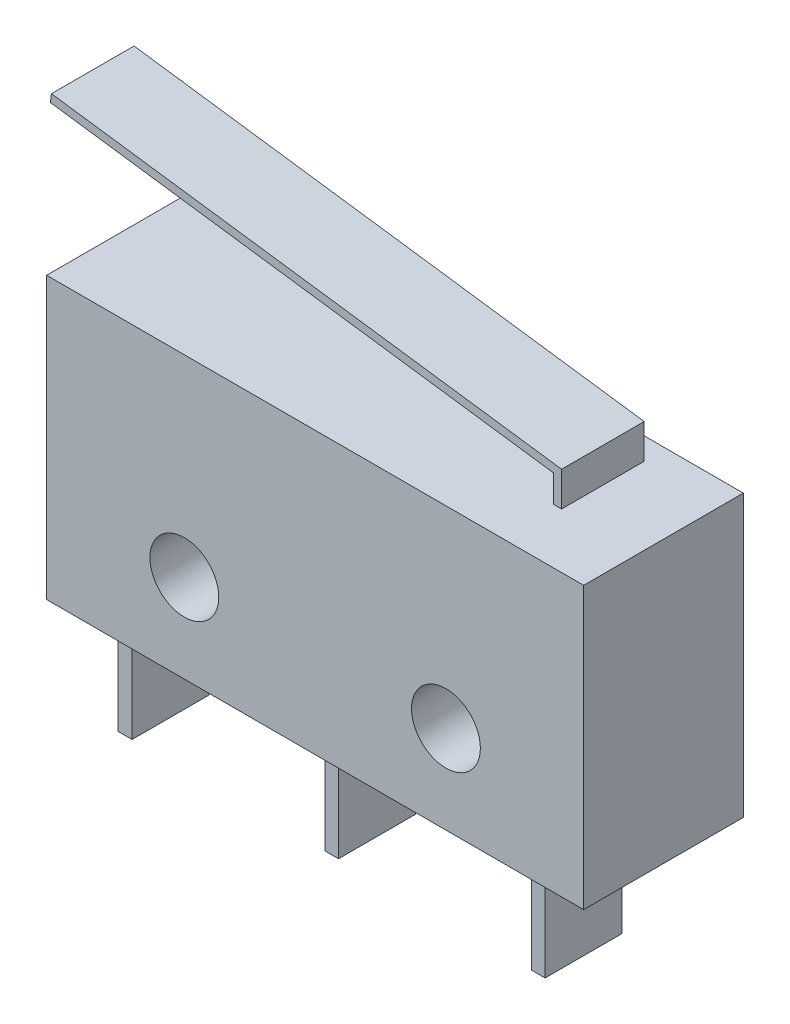
ISO-10303-21;
HEADER;
FILE_DESCRIPTION(('STEP AP214'),'2;1');
FILE_NAME('part.step','',(''),(''),'','','');
FILE_SCHEMA(('AUTOMOTIVE_DESIGN { 1 0 10303 214 1 1 1 1 }'));
ENDSEC;
DATA;
#1=APPLICATION_CONTEXT('core data for automotive mechanical design processes');
#2=APPLICATION_PROTOCOL_DEFINITION('international standard','automotive_design',2000,#1);
#3=PRODUCT_CONTEXT('',#1,'mechanical');
#4=PRODUCT('Part','Part','',(#3));
#5=PRODUCT_RELATED_PRODUCT_CATEGORY('part','',(#4));
#6=PRODUCT_DEFINITION_FORMATION('','',#4);
#7=PRODUCT_DEFINITION_CONTEXT('part definition',#1,'design');
#8=PRODUCT_DEFINITION('design','',#6,#7);
#9=PRODUCT_DEFINITION_SHAPE('','',#8);
#10=(LENGTH_UNIT() NAMED_UNIT(*) SI_UNIT(.MILLI.,.METRE.));
#11=(NAMED_UNIT(*) PLANE_ANGLE_UNIT() SI_UNIT($,.RADIAN.));
#12=(NAMED_UNIT(*) SI_UNIT($,.STERADIAN.) SOLID_ANGLE_UNIT());
#13=UNCERTAINTY_MEASURE_WITH_UNIT(LENGTH_MEASURE(1.E-05),#10,'distance_accuracy_value','');
#14=(GEOMETRIC_REPRESENTATION_CONTEXT(3) GLOBAL_UNCERTAINTY_ASSIGNED_CONTEXT((#13)) GLOBAL_UNIT_ASSIGNED_CONTEXT((#10,
#11,#12)) REPRESENTATION_CONTEXT('',''));
#15=CARTESIAN_POINT('',(0.,0.,0.));
#16=DIRECTION('',(0.,0.,1.));
#17=DIRECTION('',(1.,0.,0.));
#18=AXIS2_PLACEMENT_3D('',#15,#16,#17);
#19=CARTESIAN_POINT('',(-19.6658793052627,-12.6439834024896,-0.799999999999999));
#20=DIRECTION('',(0.,-1.,0.));
#21=DIRECTION('',(0.,0.,-1.));
#22=AXIS2_PLACEMENT_3D('',#19,#20,#21);
#23=PLANE('',#22);
#24=DIRECTION('',(-1.,0.,0.));
#25=VECTOR('',#24,1.);
#26=CARTESIAN_POINT('',(-17.4158793052627,-12.6439834024896,4.65));
#27=LINE('',#26,#25);
#28=CARTESIAN_POINT('',(-16.9158793052627,-12.6439834024896,4.65));
#29=VERTEX_POINT('',#28);
#30=CARTESIAN_POINT('',(-17.4158793052627,-12.6439834024896,4.65));
#31=VERTEX_POINT('',#30);
#32=EDGE_CURVE('E271',#29,#31,#27,.T.);
#33=ORIENTED_EDGE('',*,*,#32,.F.);
#34=DIRECTION('',(0.,0.,1.));
#35=VECTOR('',#34,1.);
#36=CARTESIAN_POINT('',(-16.9158793052627,-12.6439834024896,4.65));
#37=LINE('',#36,#35);
#38=CARTESIAN_POINT('',(-16.9158793052627,-12.6439834024896,1.85));
#39=VERTEX_POINT('',#38);
#40=EDGE_CURVE('E257',#39,#29,#37,.T.);
#41=ORIENTED_EDGE('',*,*,#40,.F.);
#42=DIRECTION('',(1.,0.,0.));
#43=VECTOR('',#42,1.);
#44=CARTESIAN_POINT('',(-16.9158793052627,-12.6439834024896,1.85));
#45=LINE('',#44,#43);
#46=CARTESIAN_POINT('',(-17.4158793052627,-12.6439834024896,1.85));
#47=VERTEX_POINT('',#46);
#48=EDGE_CURVE('E262',#47,#39,#45,.T.);
#49=ORIENTED_EDGE('',*,*,#48,.F.);
#50=DIRECTION('',(0.,0.,-1.));
#51=VECTOR('',#50,1.);
#52=CARTESIAN_POINT('',(-17.4158793052627,-12.6439834024896,1.85));
#53=LINE('',#52,#51);
#54=EDGE_CURVE('E273',#31,#47,#53,.T.);
#55=ORIENTED_EDGE('',*,*,#54,.F.);
#56=EDGE_LOOP('',(#33,#41,#49,#55));
#57=FACE_BOUND('',#56,.T.);
#58=DIRECTION('',(1.,0.,0.));
#59=VECTOR('',#58,1.);
#60=CARTESIAN_POINT('',(-19.6658793052627,-12.6439834024896,5.));
#61=LINE('',#60,#59);
#62=CARTESIAN_POINT('',(-19.6658793052627,-12.6439834024896,5.));
#63=VERTEX_POINT('',#62);
#64=CARTESIAN_POINT('',(-0.165879305262673,-12.6439834024896,5.));
#65=VERTEX_POINT('',#64);
#66=EDGE_CURVE('E315',#63,#65,#61,.T.);
#67=ORIENTED_EDGE('',*,*,#66,.F.);
#68=DIRECTION('',(0.,0.,1.));
#69=VECTOR('',#68,1.);
#70=CARTESIAN_POINT('',(-19.6658793052627,-12.6439834024896,-0.799999999999999));
#71=LINE('',#70,#69);
#72=CARTESIAN_POINT('',(-19.6658793052627,-12.6439834024896,-0.799999999999999));
#73=VERTEX_POINT('',#72);
#74=EDGE_CURVE('E11',#73,#63,#71,.T.);
#75=ORIENTED_EDGE('',*,*,#74,.F.);
#76=DIRECTION('',(1.,0.,0.));
#77=VECTOR('',#76,1.);
#78=CARTESIAN_POINT('',(-19.6658793052627,-12.6439834024896,-0.799999999999999));
#79=LINE('',#78,#77);
#80=CARTESIAN_POINT('',(-0.165879305262673,-12.6439834024896,-0.799999999999999));
#81=VERTEX_POINT('',#80);
#82=EDGE_CURVE('E316',#73,#81,#79,.T.);
#83=ORIENTED_EDGE('',*,*,#82,.T.);
#84=DIRECTION('',(0.,0.,1.));
#85=VECTOR('',#84,1.);
#86=CARTESIAN_POINT('',(-0.165879305262673,-12.6439834024896,-0.799999999999999));
#87=LINE('',#86,#85);
#88=EDGE_CURVE('E42',#81,#65,#87,.T.);
#89=ORIENTED_EDGE('',*,*,#88,.T.);
#90=EDGE_LOOP('',(#67,#75,#83,#89));
#91=FACE_BOUND('',#90,.T.);
#92=DIRECTION('',(-1.,0.,0.));
#93=VECTOR('',#92,1.);
#94=CARTESIAN_POINT('',(-9.91587930526267,-12.6439834024896,4.65));
#95=LINE('',#94,#93);
#96=CARTESIAN_POINT('',(-9.41587930526267,-12.6439834024896,4.65));
#97=VERTEX_POINT('',#96);
#98=CARTESIAN_POINT('',(-9.91587930526267,-12.6439834024896,4.65));
#99=VERTEX_POINT('',#98);
#100=EDGE_CURVE('E300',#97,#99,#95,.T.);
#101=ORIENTED_EDGE('',*,*,#100,.F.);
#102=DIRECTION('',(0.,0.,1.));
#103=VECTOR('',#102,1.);
#104=CARTESIAN_POINT('',(-9.41587930526267,-12.6439834024896,4.65));
#105=LINE('',#104,#103);
#106=CARTESIAN_POINT('',(-9.41587930526267,-12.6439834024896,1.85));
#107=VERTEX_POINT('',#106);
#108=EDGE_CURVE('E286',#107,#97,#105,.T.);
#109=ORIENTED_EDGE('',*,*,#108,.F.);
#110=DIRECTION('',(1.,0.,0.));
#111=VECTOR('',#110,1.);
#112=CARTESIAN_POINT('',(-9.41587930526267,-12.6439834024896,1.85));
#113=LINE('',#112,#111);
#114=CARTESIAN_POINT('',(-9.91587930526267,-12.6439834024896,1.85));
#115=VERTEX_POINT('',#114);
#116=EDGE_CURVE('E291',#115,#107,#113,.T.);
#117=ORIENTED_EDGE('',*,*,#116,.F.);
#118=DIRECTION('',(0.,0.,-1.));
#119=VECTOR('',#118,1.);
#120=CARTESIAN_POINT('',(-9.91587930526267,-12.6439834024896,1.85));
#121=LINE('',#120,#119);
#122=EDGE_CURVE('E302',#99,#115,#121,.T.);
#123=ORIENTED_EDGE('',*,*,#122,.F.);
#124=EDGE_LOOP('',(#101,#109,#117,#123));
#125=FACE_BOUND('',#124,.T.);
#126=DIRECTION('',(-1.,0.,0.));
#127=VECTOR('',#126,1.);
#128=CARTESIAN_POINT('',(-2.41587930526267,-12.6439834024896,4.65));
#129=LINE('',#128,#127);
#130=CARTESIAN_POINT('',(-1.91587930526267,-12.6439834024896,4.65));
#131=VERTEX_POINT('',#130);
#132=CARTESIAN_POINT('',(-2.41587930526267,-12.6439834024896,4.65));
#133=VERTEX_POINT('',#132);
#134=EDGE_CURVE('E244',#131,#133,#129,.T.);
#135=ORIENTED_EDGE('',*,*,#134,.F.);
#136=DIRECTION('',(0.,0.,1.));
#137=VECTOR('',#136,1.);
#138=CARTESIAN_POINT('',(-1.91587930526267,-12.6439834024896,4.65));
#139=LINE('',#138,#137);
#140=CARTESIAN_POINT('',(-1.91587930526267,-12.6439834024896,1.85));
#141=VERTEX_POINT('',#140);
#142=EDGE_CURVE('E230',#141,#131,#139,.T.);
#143=ORIENTED_EDGE('',*,*,#142,.F.);
#144=DIRECTION('',(1.,0.,0.));
#145=VECTOR('',#144,1.);
#146=CARTESIAN_POINT('',(-1.91587930526267,-12.6439834024896,1.85));
#147=LINE('',#146,#145);
#148=CARTESIAN_POINT('',(-2.41587930526267,-12.6439834024896,1.85));
#149=VERTEX_POINT('',#148);
#150=EDGE_CURVE('E235',#149,#141,#147,.T.);
#151=ORIENTED_EDGE('',*,*,#150,.F.);
#152=DIRECTION('',(0.,0.,-1.));
#153=VECTOR('',#152,1.);
#154=CARTESIAN_POINT('',(-2.41587930526267,-12.6439834024896,1.85));
#155=LINE('',#154,#153);
#156=EDGE_CURVE('E246',#133,#149,#155,.T.);
#157=ORIENTED_EDGE('',*,*,#156,.F.);
#158=EDGE_LOOP('',(#135,#143,#151,#157));
#159=FACE_BOUND('',#158,.T.);
#160=ADVANCED_FACE('F39',(#57,#91,#125,#159),#23,.T.);
#161=CARTESIAN_POINT('',(-19.6658793052627,-2.44398340248963,-0.799999999999999));
#162=DIRECTION('',(-1.,0.,0.));
#163=DIRECTION('',(0.,0.,1.));
#164=AXIS2_PLACEMENT_3D('',#161,#162,#163);
#165=PLANE('',#164);
#166=DIRECTION('',(0.,-1.,0.));
#167=VECTOR('',#166,1.);
#168=CARTESIAN_POINT('',(-19.6658793052627,-2.44398340248963,5.));
#169=LINE('',#168,#167);
#170=CARTESIAN_POINT('',(-19.6658793052627,-2.44398340248963,5.));
#171=VERTEX_POINT('',#170);
#172=EDGE_CURVE('E320',#171,#63,#169,.T.);
#173=ORIENTED_EDGE('',*,*,#172,.F.);
#174=DIRECTION('',(0.,0.,1.));
#175=VECTOR('',#174,1.);
#176=CARTESIAN_POINT('',(-19.6658793052627,-2.44398340248963,-0.799999999999999));
#177=LINE('',#176,#175);
#178=CARTESIAN_POINT('',(-19.6658793052627,-2.44398340248963,-0.799999999999999));
#179=VERTEX_POINT('',#178);
#180=EDGE_CURVE('E47',#179,#171,#177,.T.);
#181=ORIENTED_EDGE('',*,*,#180,.F.);
#182=DIRECTION('',(0.,-1.,0.));
#183=VECTOR('',#182,1.);
#184=CARTESIAN_POINT('',(-19.6658793052627,-2.44398340248963,-0.799999999999999));
#185=LINE('',#184,#183);
#186=EDGE_CURVE('E326',#179,#73,#185,.T.);
#187=ORIENTED_EDGE('',*,*,#186,.T.);
#188=ORIENTED_EDGE('',*,*,#74,.T.);
#189=EDGE_LOOP('',(#173,#181,#187,#188));
#190=FACE_BOUND('',#189,.T.);
#191=ADVANCED_FACE('F353',(#190),#165,.T.);
#192=CARTESIAN_POINT('',(-0.165879305262673,-2.44398340248962,-0.799999999999999));
#193=DIRECTION('',(0.,1.,0.));
#194=DIRECTION('',(-1.,0.,0.));
#195=AXIS2_PLACEMENT_3D('',#192,#193,#194);
#196=PLANE('',#195);
#197=DIRECTION('',(1.,0.,0.));
#198=VECTOR('',#197,1.);
#199=CARTESIAN_POINT('',(-2.96587930526267,-2.44398340248962,3.));
#200=LINE('',#199,#198);
#201=CARTESIAN_POINT('',(-3.26587930526267,-2.44398340248962,3.));
#202=VERTEX_POINT('',#201);
#203=CARTESIAN_POINT('',(-2.96587930526267,-2.44398340248962,3.));
#204=VERTEX_POINT('',#203);
#205=EDGE_CURVE('E625',#202,#204,#200,.T.);
#206=ORIENTED_EDGE('',*,*,#205,.F.);
#207=DIRECTION('',(0.,0.,-1.));
#208=VECTOR('',#207,1.);
#209=CARTESIAN_POINT('',(-3.26587930526267,-2.44398340248962,3.));
#210=LINE('',#209,#208);
#211=CARTESIAN_POINT('',(-3.26587930526267,-2.44398340248962,0.));
#212=VERTEX_POINT('',#211);
#213=EDGE_CURVE('E616',#202,#212,#210,.T.);
#214=ORIENTED_EDGE('',*,*,#213,.T.);
#215=DIRECTION('',(1.,0.,0.));
#216=VECTOR('',#215,1.);
#217=CARTESIAN_POINT('',(-2.96587930526267,-2.44398340248962,0.));
#218=LINE('',#217,#216);
#219=CARTESIAN_POINT('',(-2.96587930526267,-2.44398340248962,0.));
#220=VERTEX_POINT('',#219);
#221=EDGE_CURVE('E608',#212,#220,#218,.T.);
#222=ORIENTED_EDGE('',*,*,#221,.T.);
#223=DIRECTION('',(0.,0.,-1.));
#224=VECTOR('',#223,1.);
#225=CARTESIAN_POINT('',(-2.96587930526267,-2.44398340248962,3.));
#226=LINE('',#225,#224);
#227=EDGE_CURVE('E614',#204,#220,#226,.T.);
#228=ORIENTED_EDGE('',*,*,#227,.F.);
#229=EDGE_LOOP('',(#206,#214,#222,#228));
#230=FACE_BOUND('',#229,.T.);
#231=DIRECTION('',(-1.,0.,0.));
#232=VECTOR('',#231,1.);
#233=CARTESIAN_POINT('',(-0.165879305262673,-2.44398340248962,5.));
#234=LINE('',#233,#232);
#235=CARTESIAN_POINT('',(-0.165879305262673,-2.44398340248962,5.));
#236=VERTEX_POINT('',#235);
#237=EDGE_CURVE('E334',#236,#171,#234,.T.);
#238=ORIENTED_EDGE('',*,*,#237,.F.);
#239=DIRECTION('',(0.,0.,1.));
#240=VECTOR('',#239,1.);
#241=CARTESIAN_POINT('',(-0.165879305262673,-2.44398340248962,-0.799999999999999));
#242=LINE('',#241,#240);
#243=CARTESIAN_POINT('',(-0.165879305262673,-2.44398340248962,-0.799999999999999));
#244=VERTEX_POINT('',#243);
#245=EDGE_CURVE('E339',#244,#236,#242,.T.);
#246=ORIENTED_EDGE('',*,*,#245,.F.);
#247=DIRECTION('',(-1.,0.,0.));
#248=VECTOR('',#247,1.);
#249=CARTESIAN_POINT('',(-0.165879305262673,-2.44398340248962,-0.799999999999999));
#250=LINE('',#249,#248);
#251=EDGE_CURVE('E323',#244,#179,#250,.T.);
#252=ORIENTED_EDGE('',*,*,#251,.T.);
#253=ORIENTED_EDGE('',*,*,#180,.T.);
#254=EDGE_LOOP('',(#238,#246,#252,#253));
#255=FACE_BOUND('',#254,.T.);
#256=ADVANCED_FACE('F359',(#230,#255),#196,.T.);
#257=CARTESIAN_POINT('',(-0.165879305262673,-12.6439834024896,-0.799999999999999));
#258=DIRECTION('',(1.,0.,0.));
#259=DIRECTION('',(0.,0.,-1.));
#260=AXIS2_PLACEMENT_3D('',#257,#258,#259);
#261=PLANE('',#260);
#262=DIRECTION('',(0.,1.,0.));
#263=VECTOR('',#262,1.);
#264=CARTESIAN_POINT('',(-0.165879305262673,-12.6439834024896,5.));
#265=LINE('',#264,#263);
#266=EDGE_CURVE('E331',#65,#236,#265,.T.);
#267=ORIENTED_EDGE('',*,*,#266,.F.);
#268=ORIENTED_EDGE('',*,*,#88,.F.);
#269=DIRECTION('',(0.,1.,0.));
#270=VECTOR('',#269,1.);
#271=CARTESIAN_POINT('',(-0.165879305262673,-12.6439834024896,-0.799999999999999));
#272=LINE('',#271,#270);
#273=EDGE_CURVE('E319',#81,#244,#272,.T.);
#274=ORIENTED_EDGE('',*,*,#273,.T.);
#275=ORIENTED_EDGE('',*,*,#245,.T.);
#276=EDGE_LOOP('',(#267,#268,#274,#275));
#277=FACE_BOUND('',#276,.T.);
#278=ADVANCED_FACE('F348',(#277),#261,.T.);
#279=CARTESIAN_POINT('',(0.,0.,-0.799999999999999));
#280=DIRECTION('',(0.,0.,1.));
#281=DIRECTION('',(1.,0.,0.));
#282=AXIS2_PLACEMENT_3D('',#279,#280,#281);
#283=PLANE('',#282);
#284=CARTESIAN_POINT('',(-14.6658793052627,-9.44398340248962,-0.799999999999999));
#285=DIRECTION('',(0.,0.,-1.));
#286=DIRECTION('',(-1.,0.,0.));
#287=AXIS2_PLACEMENT_3D('',#284,#285,#286);
#288=CIRCLE('',#287,1.25);
#289=CARTESIAN_POINT('',(-15.9158793052627,-9.44398340248962,-0.799999999999999));
#290=VERTEX_POINT('',#289);
#291=EDGE_CURVE('E213',#290,#290,#288,.T.);
#292=ORIENTED_EDGE('',*,*,#291,.F.);
#293=EDGE_LOOP('',(#292));
#294=FACE_BOUND('',#293,.T.);
#295=CARTESIAN_POINT('',(-5.16587930526267,-9.44398340248962,-0.799999999999999));
#296=DIRECTION('',(0.,0.,-1.));
#297=DIRECTION('',(-1.,0.,0.));
#298=AXIS2_PLACEMENT_3D('',#295,#296,#297);
#299=CIRCLE('',#298,1.25);
#300=CARTESIAN_POINT('',(-6.41587930526267,-9.44398340248962,-0.799999999999999));
#301=VERTEX_POINT('',#300);
#302=EDGE_CURVE('E224',#301,#301,#299,.T.);
#303=ORIENTED_EDGE('',*,*,#302,.F.);
#304=EDGE_LOOP('',(#303));
#305=FACE_BOUND('',#304,.T.);
#306=ORIENTED_EDGE('',*,*,#82,.F.);
#307=ORIENTED_EDGE('',*,*,#186,.F.);
#308=ORIENTED_EDGE('',*,*,#251,.F.);
#309=ORIENTED_EDGE('',*,*,#273,.F.);
#310=EDGE_LOOP('',(#306,#307,#308,#309));
#311=FACE_BOUND('',#310,.T.);
#312=ADVANCED_FACE('F356',(#294,#305,#311),#283,.F.);
#313=CARTESIAN_POINT('',(0.,0.,5.));
#314=DIRECTION('',(0.,0.,1.));
#315=DIRECTION('',(1.,0.,0.));
#316=AXIS2_PLACEMENT_3D('',#313,#314,#315);
#317=PLANE('',#316);
#318=CARTESIAN_POINT('',(-14.6658793052627,-9.44398340248962,5.));
#319=DIRECTION('',(0.,0.,1.));
#320=DIRECTION('',(1.,0.,0.));
#321=AXIS2_PLACEMENT_3D('',#318,#319,#320);
#322=CIRCLE('',#321,1.25);
#323=CARTESIAN_POINT('',(-13.4158793052627,-9.44398340248962,5.));
#324=VERTEX_POINT('',#323);
#325=EDGE_CURVE('E216',#324,#324,#322,.T.);
#326=ORIENTED_EDGE('',*,*,#325,.F.);
#327=EDGE_LOOP('',(#326));
#328=FACE_BOUND('',#327,.T.);
#329=CARTESIAN_POINT('',(-5.16587930526267,-9.44398340248962,5.));
#330=DIRECTION('',(0.,0.,1.));
#331=DIRECTION('',(1.,0.,0.));
#332=AXIS2_PLACEMENT_3D('',#329,#330,#331);
#333=CIRCLE('',#332,1.25);
#334=CARTESIAN_POINT('',(-3.91587930526268,-9.44398340248962,5.));
#335=VERTEX_POINT('',#334);
#336=EDGE_CURVE('E227',#335,#335,#333,.T.);
#337=ORIENTED_EDGE('',*,*,#336,.F.);
#338=EDGE_LOOP('',(#337));
#339=FACE_BOUND('',#338,.T.);
#340=ORIENTED_EDGE('',*,*,#66,.T.);
#341=ORIENTED_EDGE('',*,*,#266,.T.);
#342=ORIENTED_EDGE('',*,*,#237,.T.);
#343=ORIENTED_EDGE('',*,*,#172,.T.);
#344=EDGE_LOOP('',(#340,#341,#342,#343));
#345=FACE_BOUND('',#344,.T.);
#346=ADVANCED_FACE('F350',(#328,#339,#345),#317,.T.);
#347=CARTESIAN_POINT('',(-9.41587930526267,-15.8439834024896,4.65));
#348=DIRECTION('',(-1.,0.,0.));
#349=DIRECTION('',(0.,0.,1.));
#350=AXIS2_PLACEMENT_3D('',#347,#348,#349);
#351=PLANE('',#350);
#352=ORIENTED_EDGE('',*,*,#108,.T.);
#353=DIRECTION('',(0.,1.,0.));
#354=VECTOR('',#353,1.);
#355=CARTESIAN_POINT('',(-9.41587930526267,-15.8439834024896,4.65));
#356=LINE('',#355,#354);
#357=CARTESIAN_POINT('',(-9.41587930526267,-15.8439834024896,4.65));
#358=VERTEX_POINT('',#357);
#359=EDGE_CURVE('E313',#358,#97,#356,.T.);
#360=ORIENTED_EDGE('',*,*,#359,.F.);
#361=DIRECTION('',(0.,0.,1.));
#362=VECTOR('',#361,1.);
#363=CARTESIAN_POINT('',(-9.41587930526267,-15.8439834024896,4.65));
#364=LINE('',#363,#362);
#365=CARTESIAN_POINT('',(-9.41587930526267,-15.8439834024896,1.85));
#366=VERTEX_POINT('',#365);
#367=EDGE_CURVE('E287',#366,#358,#364,.T.);
#368=ORIENTED_EDGE('',*,*,#367,.F.);
#369=DIRECTION('',(0.,1.,0.));
#370=VECTOR('',#369,1.);
#371=CARTESIAN_POINT('',(-9.41587930526267,-15.8439834024896,1.85));
#372=LINE('',#371,#370);
#373=EDGE_CURVE('E297',#366,#107,#372,.T.);
#374=ORIENTED_EDGE('',*,*,#373,.T.);
#375=EDGE_LOOP('',(#352,#360,#368,#374));
#376=FACE_BOUND('',#375,.T.);
#377=ADVANCED_FACE('F424',(#376),#351,.F.);
#378=CARTESIAN_POINT('',(-9.91587930526267,-15.8439834024896,4.65));
#379=DIRECTION('',(0.,0.,-1.));
#380=DIRECTION('',(-1.,0.,0.));
#381=AXIS2_PLACEMENT_3D('',#378,#379,#380);
#382=PLANE('',#381);
#383=ORIENTED_EDGE('',*,*,#100,.T.);
#384=DIRECTION('',(0.,1.,0.));
#385=VECTOR('',#384,1.);
#386=CARTESIAN_POINT('',(-9.91587930526267,-15.8439834024896,4.65));
#387=LINE('',#386,#385);
#388=CARTESIAN_POINT('',(-9.91587930526267,-15.8439834024896,4.65));
#389=VERTEX_POINT('',#388);
#390=EDGE_CURVE('E310',#389,#99,#387,.T.);
#391=ORIENTED_EDGE('',*,*,#390,.F.);
#392=DIRECTION('',(-1.,0.,0.));
#393=VECTOR('',#392,1.);
#394=CARTESIAN_POINT('',(-9.91587930526267,-15.8439834024896,4.65));
#395=LINE('',#394,#393);
#396=EDGE_CURVE('E290',#358,#389,#395,.T.);
#397=ORIENTED_EDGE('',*,*,#396,.F.);
#398=ORIENTED_EDGE('',*,*,#359,.T.);
#399=EDGE_LOOP('',(#383,#391,#397,#398));
#400=FACE_BOUND('',#399,.T.);
#401=ADVANCED_FACE('F420',(#400),#382,.F.);
#402=CARTESIAN_POINT('',(-9.91587930526267,-15.8439834024896,1.85));
#403=DIRECTION('',(1.,0.,0.));
#404=DIRECTION('',(0.,0.,-1.));
#405=AXIS2_PLACEMENT_3D('',#402,#403,#404);
#406=PLANE('',#405);
#407=ORIENTED_EDGE('',*,*,#122,.T.);
#408=DIRECTION('',(0.,1.,0.));
#409=VECTOR('',#408,1.);
#410=CARTESIAN_POINT('',(-9.91587930526267,-15.8439834024896,1.85));
#411=LINE('',#410,#409);
#412=CARTESIAN_POINT('',(-9.91587930526267,-15.8439834024896,1.85));
#413=VERTEX_POINT('',#412);
#414=EDGE_CURVE('E308',#413,#115,#411,.T.);
#415=ORIENTED_EDGE('',*,*,#414,.F.);
#416=DIRECTION('',(0.,0.,-1.));
#417=VECTOR('',#416,1.);
#418=CARTESIAN_POINT('',(-9.91587930526267,-15.8439834024896,1.85));
#419=LINE('',#418,#417);
#420=EDGE_CURVE('E293',#389,#413,#419,.T.);
#421=ORIENTED_EDGE('',*,*,#420,.F.);
#422=ORIENTED_EDGE('',*,*,#390,.T.);
#423=EDGE_LOOP('',(#407,#415,#421,#422));
#424=FACE_BOUND('',#423,.T.);
#425=ADVANCED_FACE('F416',(#424),#406,.F.);
#426=CARTESIAN_POINT('',(-9.41587930526267,-15.8439834024896,1.85));
#427=DIRECTION('',(0.,0.,1.));
#428=DIRECTION('',(1.,0.,0.));
#429=AXIS2_PLACEMENT_3D('',#426,#427,#428);
#430=PLANE('',#429);
#431=ORIENTED_EDGE('',*,*,#116,.T.);
#432=ORIENTED_EDGE('',*,*,#373,.F.);
#433=DIRECTION('',(1.,0.,0.));
#434=VECTOR('',#433,1.);
#435=CARTESIAN_POINT('',(-9.41587930526267,-15.8439834024896,1.85));
#436=LINE('',#435,#434);
#437=EDGE_CURVE('E295',#413,#366,#436,.T.);
#438=ORIENTED_EDGE('',*,*,#437,.F.);
#439=ORIENTED_EDGE('',*,*,#414,.T.);
#440=EDGE_LOOP('',(#431,#432,#438,#439));
#441=FACE_BOUND('',#440,.T.);
#442=ADVANCED_FACE('F412',(#441),#430,.F.);
#443=CARTESIAN_POINT('',(0.,-15.8439834024896,0.));
#444=DIRECTION('',(0.,1.,0.));
#445=DIRECTION('',(0.,0.,1.));
#446=AXIS2_PLACEMENT_3D('',#443,#444,#445);
#447=PLANE('',#446);
#448=ORIENTED_EDGE('',*,*,#367,.T.);
#449=ORIENTED_EDGE('',*,*,#396,.T.);
#450=ORIENTED_EDGE('',*,*,#420,.T.);
#451=ORIENTED_EDGE('',*,*,#437,.T.);
#452=EDGE_LOOP('',(#448,#449,#450,#451));
#453=FACE_BOUND('',#452,.T.);
#454=ADVANCED_FACE('F409',(#453),#447,.F.);
#455=CARTESIAN_POINT('',(-16.9158793052627,-15.8439834024896,4.65));
#456=DIRECTION('',(-1.,0.,0.));
#457=DIRECTION('',(0.,0.,1.));
#458=AXIS2_PLACEMENT_3D('',#455,#456,#457);
#459=PLANE('',#458);
#460=ORIENTED_EDGE('',*,*,#40,.T.);
#461=DIRECTION('',(0.,1.,0.));
#462=VECTOR('',#461,1.);
#463=CARTESIAN_POINT('',(-16.9158793052627,-15.8439834024896,4.65));
#464=LINE('',#463,#462);
#465=CARTESIAN_POINT('',(-16.9158793052627,-15.8439834024896,4.65));
#466=VERTEX_POINT('',#465);
#467=EDGE_CURVE('E284',#466,#29,#464,.T.);
#468=ORIENTED_EDGE('',*,*,#467,.F.);
#469=DIRECTION('',(0.,0.,1.));
#470=VECTOR('',#469,1.);
#471=CARTESIAN_POINT('',(-16.9158793052627,-15.8439834024896,4.65));
#472=LINE('',#471,#470);
#473=CARTESIAN_POINT('',(-16.9158793052627,-15.8439834024896,1.85));
#474=VERTEX_POINT('',#473);
#475=EDGE_CURVE('E258',#474,#466,#472,.T.);
#476=ORIENTED_EDGE('',*,*,#475,.F.);
#477=DIRECTION('',(0.,1.,0.));
#478=VECTOR('',#477,1.);
#479=CARTESIAN_POINT('',(-16.9158793052627,-15.8439834024896,1.85));
#480=LINE('',#479,#478);
#481=EDGE_CURVE('E268',#474,#39,#480,.T.);
#482=ORIENTED_EDGE('',*,*,#481,.T.);
#483=EDGE_LOOP('',(#460,#468,#476,#482));
#484=FACE_BOUND('',#483,.T.);
#485=ADVANCED_FACE('F391',(#484),#459,.F.);
#486=CARTESIAN_POINT('',(-17.4158793052627,-15.8439834024896,4.65));
#487=DIRECTION('',(0.,0.,-1.));
#488=DIRECTION('',(-1.,0.,0.));
#489=AXIS2_PLACEMENT_3D('',#486,#487,#488);
#490=PLANE('',#489);
#491=ORIENTED_EDGE('',*,*,#32,.T.);
#492=DIRECTION('',(0.,1.,0.));
#493=VECTOR('',#492,1.);
#494=CARTESIAN_POINT('',(-17.4158793052627,-15.8439834024896,4.65));
#495=LINE('',#494,#493);
#496=CARTESIAN_POINT('',(-17.4158793052627,-15.8439834024896,4.65));
#497=VERTEX_POINT('',#496);
#498=EDGE_CURVE('E281',#497,#31,#495,.T.);
#499=ORIENTED_EDGE('',*,*,#498,.F.);
#500=DIRECTION('',(-1.,0.,0.));
#501=VECTOR('',#500,1.);
#502=CARTESIAN_POINT('',(-17.4158793052627,-15.8439834024896,4.65));
#503=LINE('',#502,#501);
#504=EDGE_CURVE('E261',#466,#497,#503,.T.);
#505=ORIENTED_EDGE('',*,*,#504,.F.);
#506=ORIENTED_EDGE('',*,*,#467,.T.);
#507=EDGE_LOOP('',(#491,#499,#505,#506));
#508=FACE_BOUND('',#507,.T.);
#509=ADVANCED_FACE('F379',(#508),#490,.F.);
#510=CARTESIAN_POINT('',(-17.4158793052627,-15.8439834024896,1.85));
#511=DIRECTION('',(1.,0.,0.));
#512=DIRECTION('',(0.,0.,-1.));
#513=AXIS2_PLACEMENT_3D('',#510,#511,#512);
#514=PLANE('',#513);
#515=ORIENTED_EDGE('',*,*,#54,.T.);
#516=DIRECTION('',(0.,1.,0.));
#517=VECTOR('',#516,1.);
#518=CARTESIAN_POINT('',(-17.4158793052627,-15.8439834024896,1.85));
#519=LINE('',#518,#517);
#520=CARTESIAN_POINT('',(-17.4158793052627,-15.8439834024896,1.85));
#521=VERTEX_POINT('',#520);
#522=EDGE_CURVE('E279',#521,#47,#519,.T.);
#523=ORIENTED_EDGE('',*,*,#522,.F.);
#524=DIRECTION('',(0.,0.,-1.));
#525=VECTOR('',#524,1.);
#526=CARTESIAN_POINT('',(-17.4158793052627,-15.8439834024896,1.85));
#527=LINE('',#526,#525);
#528=EDGE_CURVE('E264',#497,#521,#527,.T.);
#529=ORIENTED_EDGE('',*,*,#528,.F.);
#530=ORIENTED_EDGE('',*,*,#498,.T.);
#531=EDGE_LOOP('',(#515,#523,#529,#530));
#532=FACE_BOUND('',#531,.T.);
#533=ADVANCED_FACE('F383',(#532),#514,.F.);
#534=CARTESIAN_POINT('',(-16.9158793052627,-15.8439834024896,1.85));
#535=DIRECTION('',(0.,0.,1.));
#536=DIRECTION('',(1.,0.,0.));
#537=AXIS2_PLACEMENT_3D('',#534,#535,#536);
#538=PLANE('',#537);
#539=ORIENTED_EDGE('',*,*,#48,.T.);
#540=ORIENTED_EDGE('',*,*,#481,.F.);
#541=DIRECTION('',(1.,0.,0.));
#542=VECTOR('',#541,1.);
#543=CARTESIAN_POINT('',(-16.9158793052627,-15.8439834024896,1.85));
#544=LINE('',#543,#542);
#545=EDGE_CURVE('E266',#521,#474,#544,.T.);
#546=ORIENTED_EDGE('',*,*,#545,.F.);
#547=ORIENTED_EDGE('',*,*,#522,.T.);
#548=EDGE_LOOP('',(#539,#540,#546,#547));
#549=FACE_BOUND('',#548,.T.);
#550=ADVANCED_FACE('F393',(#549),#538,.F.);
#551=CARTESIAN_POINT('',(0.,-15.8439834024896,0.));
#552=DIRECTION('',(0.,1.,0.));
#553=DIRECTION('',(0.,0.,1.));
#554=AXIS2_PLACEMENT_3D('',#551,#552,#553);
#555=PLANE('',#554);
#556=ORIENTED_EDGE('',*,*,#475,.T.);
#557=ORIENTED_EDGE('',*,*,#504,.T.);
#558=ORIENTED_EDGE('',*,*,#528,.T.);
#559=ORIENTED_EDGE('',*,*,#545,.T.);
#560=EDGE_LOOP('',(#556,#557,#558,#559));
#561=FACE_BOUND('',#560,.T.);
#562=ADVANCED_FACE('F387',(#561),#555,.F.);
#563=CARTESIAN_POINT('',(-1.91587930526267,-15.8439834024896,4.65));
#564=DIRECTION('',(-1.,0.,0.));
#565=DIRECTION('',(0.,0.,1.));
#566=AXIS2_PLACEMENT_3D('',#563,#564,#565);
#567=PLANE('',#566);
#568=ORIENTED_EDGE('',*,*,#142,.T.);
#569=DIRECTION('',(0.,1.,0.));
#570=VECTOR('',#569,1.);
#571=CARTESIAN_POINT('',(-1.91587930526267,-15.8439834024896,4.65));
#572=LINE('',#571,#570);
#573=CARTESIAN_POINT('',(-1.91587930526267,-15.8439834024896,4.65));
#574=VERTEX_POINT('',#573);
#575=EDGE_CURVE('E255',#574,#131,#572,.T.);
#576=ORIENTED_EDGE('',*,*,#575,.F.);
#577=DIRECTION('',(0.,0.,1.));
#578=VECTOR('',#577,1.);
#579=CARTESIAN_POINT('',(-1.91587930526267,-15.8439834024896,4.65));
#580=LINE('',#579,#578);
#581=CARTESIAN_POINT('',(-1.91587930526267,-15.8439834024896,1.85));
#582=VERTEX_POINT('',#581);
#583=EDGE_CURVE('E231',#582,#574,#580,.T.);
#584=ORIENTED_EDGE('',*,*,#583,.F.);
#585=DIRECTION('',(0.,1.,0.));
#586=VECTOR('',#585,1.);
#587=CARTESIAN_POINT('',(-1.91587930526267,-15.8439834024896,1.85));
#588=LINE('',#587,#586);
#589=EDGE_CURVE('E241',#582,#141,#588,.T.);
#590=ORIENTED_EDGE('',*,*,#589,.T.);
#591=EDGE_LOOP('',(#568,#576,#584,#590));
#592=FACE_BOUND('',#591,.T.);
#593=ADVANCED_FACE('F400',(#592),#567,.F.);
#594=CARTESIAN_POINT('',(-2.41587930526267,-15.8439834024896,4.65));
#595=DIRECTION('',(0.,0.,-1.));
#596=DIRECTION('',(-1.,0.,0.));
#597=AXIS2_PLACEMENT_3D('',#594,#595,#596);
#598=PLANE('',#597);
#599=ORIENTED_EDGE('',*,*,#134,.T.);
#600=DIRECTION('',(0.,1.,0.));
#601=VECTOR('',#600,1.);
#602=CARTESIAN_POINT('',(-2.41587930526267,-15.8439834024896,4.65));
#603=LINE('',#602,#601);
#604=CARTESIAN_POINT('',(-2.41587930526267,-15.8439834024896,4.65));
#605=VERTEX_POINT('',#604);
#606=EDGE_CURVE('E252',#605,#133,#603,.T.);
#607=ORIENTED_EDGE('',*,*,#606,.F.);
#608=DIRECTION('',(-1.,0.,0.));
#609=VECTOR('',#608,1.);
#610=CARTESIAN_POINT('',(-2.41587930526267,-15.8439834024896,4.65));
#611=LINE('',#610,#609);
#612=EDGE_CURVE('E234',#574,#605,#611,.T.);
#613=ORIENTED_EDGE('',*,*,#612,.F.);
#614=ORIENTED_EDGE('',*,*,#575,.T.);
#615=EDGE_LOOP('',(#599,#607,#613,#614));
#616=FACE_BOUND('',#615,.T.);
#617=ADVANCED_FACE('F464',(#616),#598,.F.);
#618=CARTESIAN_POINT('',(-2.41587930526267,-15.8439834024896,1.85));
#619=DIRECTION('',(1.,0.,0.));
#620=DIRECTION('',(0.,0.,-1.));
#621=AXIS2_PLACEMENT_3D('',#618,#619,#620);
#622=PLANE('',#621);
#623=ORIENTED_EDGE('',*,*,#156,.T.);
#624=DIRECTION('',(0.,1.,0.));
#625=VECTOR('',#624,1.);
#626=CARTESIAN_POINT('',(-2.41587930526267,-15.8439834024896,1.85));
#627=LINE('',#626,#625);
#628=CARTESIAN_POINT('',(-2.41587930526267,-15.8439834024896,1.85));
#629=VERTEX_POINT('',#628);
#630=EDGE_CURVE('E63',#629,#149,#627,.T.);
#631=ORIENTED_EDGE('',*,*,#630,.F.);
#632=DIRECTION('',(0.,0.,-1.));
#633=VECTOR('',#632,1.);
#634=CARTESIAN_POINT('',(-2.41587930526267,-15.8439834024896,1.85));
#635=LINE('',#634,#633);
#636=EDGE_CURVE('E237',#605,#629,#635,.T.);
#637=ORIENTED_EDGE('',*,*,#636,.F.);
#638=ORIENTED_EDGE('',*,*,#606,.T.);
#639=EDGE_LOOP('',(#623,#631,#637,#638));
#640=FACE_BOUND('',#639,.T.);
#641=ADVANCED_FACE('F461',(#640),#622,.F.);
#642=CARTESIAN_POINT('',(-1.91587930526267,-15.8439834024896,1.85));
#643=DIRECTION('',(0.,0.,1.));
#644=DIRECTION('',(1.,0.,0.));
#645=AXIS2_PLACEMENT_3D('',#642,#643,#644);
#646=PLANE('',#645);
#647=ORIENTED_EDGE('',*,*,#150,.T.);
#648=ORIENTED_EDGE('',*,*,#589,.F.);
#649=DIRECTION('',(1.,0.,0.));
#650=VECTOR('',#649,1.);
#651=CARTESIAN_POINT('',(-1.91587930526267,-15.8439834024896,1.85));
#652=LINE('',#651,#650);
#653=EDGE_CURVE('E239',#629,#582,#652,.T.);
#654=ORIENTED_EDGE('',*,*,#653,.F.);
#655=ORIENTED_EDGE('',*,*,#630,.T.);
#656=EDGE_LOOP('',(#647,#648,#654,#655));
#657=FACE_BOUND('',#656,.T.);
#658=ADVANCED_FACE('F454',(#657),#646,.F.);
#659=CARTESIAN_POINT('',(0.,-15.8439834024896,0.));
#660=DIRECTION('',(0.,1.,0.));
#661=DIRECTION('',(0.,0.,1.));
#662=AXIS2_PLACEMENT_3D('',#659,#660,#661);
#663=PLANE('',#662);
#664=ORIENTED_EDGE('',*,*,#583,.T.);
#665=ORIENTED_EDGE('',*,*,#612,.T.);
#666=ORIENTED_EDGE('',*,*,#636,.T.);
#667=ORIENTED_EDGE('',*,*,#653,.T.);
#668=EDGE_LOOP('',(#664,#665,#666,#667));
#669=FACE_BOUND('',#668,.T.);
#670=ADVANCED_FACE('F444',(#669),#663,.F.);
#671=CARTESIAN_POINT('',(-5.16587930526267,-9.44398340248962,-0.799999999999999));
#672=DIRECTION('',(0.,0.,-1.));
#673=DIRECTION('',(-1.,0.,0.));
#674=AXIS2_PLACEMENT_3D('',#671,#672,#673);
#675=CYLINDRICAL_SURFACE('',#674,1.25);
#676=ORIENTED_EDGE('',*,*,#336,.T.);
#677=EDGE_LOOP('',(#676));
#678=FACE_BOUND('',#677,.T.);
#679=ORIENTED_EDGE('',*,*,#302,.T.);
#680=EDGE_LOOP('',(#679));
#681=FACE_BOUND('',#680,.T.);
#682=ADVANCED_FACE('F440',(#678,#681),#675,.F.);
#683=CARTESIAN_POINT('',(-14.6658793052627,-9.44398340248962,-0.799999999999999));
#684=DIRECTION('',(0.,0.,-1.));
#685=DIRECTION('',(-1.,0.,0.));
#686=AXIS2_PLACEMENT_3D('',#683,#684,#685);
#687=CYLINDRICAL_SURFACE('',#686,1.25);
#688=ORIENTED_EDGE('',*,*,#325,.T.);
#689=EDGE_LOOP('',(#688));
#690=FACE_BOUND('',#689,.T.);
#691=ORIENTED_EDGE('',*,*,#291,.T.);
#692=EDGE_LOOP('',(#691));
#693=FACE_BOUND('',#692,.T.);
#694=ADVANCED_FACE('F443',(#690,#693),#687,.F.);
#695=CARTESIAN_POINT('',(-2.96587930526267,-1.19398340248962,3.));
#696=DIRECTION('',(-0.136214108370337,-0.990679421750989,0.));
#697=DIRECTION('',(0.990679421750989,-0.136214108370337,0.));
#698=AXIS2_PLACEMENT_3D('',#695,#696,#697);
#699=PLANE('',#698);
#700=DIRECTION('',(-0.990679421750989,0.136214108370337,0.));
#701=VECTOR('',#700,1.);
#702=CARTESIAN_POINT('',(-2.96587930526267,-1.19398340248962,0.));
#703=LINE('',#702,#701);
#704=CARTESIAN_POINT('',(-2.96587930526267,-1.19398340248962,0.));
#705=VERTEX_POINT('',#704);
#706=CARTESIAN_POINT('',(-21.4915844920062,1.35322042403567,0.));
#707=VERTEX_POINT('',#706);
#708=EDGE_CURVE('E212',#705,#707,#703,.T.);
#709=ORIENTED_EDGE('',*,*,#708,.T.);
#710=DIRECTION('',(0.,0.,-1.));
#711=VECTOR('',#710,1.);
#712=CARTESIAN_POINT('',(-21.4915844920062,1.35322042403567,3.));
#713=LINE('',#712,#711);
#714=CARTESIAN_POINT('',(-21.4915844920062,1.35322042403567,3.));
#715=VERTEX_POINT('',#714);
#716=EDGE_CURVE('E194',#715,#707,#713,.T.);
#717=ORIENTED_EDGE('',*,*,#716,.F.);
#718=DIRECTION('',(-0.990679421750989,0.136214108370337,0.));
#719=VECTOR('',#718,1.);
#720=CARTESIAN_POINT('',(-2.96587930526267,-1.19398340248962,3.));
#721=LINE('',#720,#719);
#722=CARTESIAN_POINT('',(-2.96587930526267,-1.19398340248962,3.));
#723=VERTEX_POINT('',#722);
#724=EDGE_CURVE('E201',#723,#715,#721,.T.);
#725=ORIENTED_EDGE('',*,*,#724,.F.);
#726=DIRECTION('',(0.,0.,-1.));
#727=VECTOR('',#726,1.);
#728=CARTESIAN_POINT('',(-2.96587930526267,-1.19398340248962,3.));
#729=LINE('',#728,#727);
#730=EDGE_CURVE('E612',#723,#705,#729,.T.);
#731=ORIENTED_EDGE('',*,*,#730,.T.);
#732=EDGE_LOOP('',(#709,#717,#725,#731));
#733=FACE_BOUND('',#732,.T.);
#734=ADVANCED_FACE('F211',(#733),#699,.F.);
#735=CARTESIAN_POINT('',(-21.4915844920062,1.35322042403567,3.));
#736=DIRECTION('',(0.990679421750987,-0.136214108370352,0.));
#737=DIRECTION('',(0.136214108370352,0.990679421750987,0.));
#738=AXIS2_PLACEMENT_3D('',#735,#736,#737);
#739=PLANE('',#738);
#740=DIRECTION('',(-0.136214108370352,-0.990679421750987,0.));
#741=VECTOR('',#740,1.);
#742=CARTESIAN_POINT('',(-21.4915844920062,1.35322042403567,0.));
#743=LINE('',#742,#741);
#744=CARTESIAN_POINT('',(-21.5324487245173,1.05601659751038,0.));
#745=VERTEX_POINT('',#744);
#746=EDGE_CURVE('E598',#707,#745,#743,.T.);
#747=ORIENTED_EDGE('',*,*,#746,.T.);
#748=DIRECTION('',(0.,0.,-1.));
#749=VECTOR('',#748,1.);
#750=CARTESIAN_POINT('',(-21.5324487245173,1.05601659751038,3.));
#751=LINE('',#750,#749);
#752=CARTESIAN_POINT('',(-21.5324487245173,1.05601659751038,3.));
#753=VERTEX_POINT('',#752);
#754=EDGE_CURVE('E197',#753,#745,#751,.T.);
#755=ORIENTED_EDGE('',*,*,#754,.F.);
#756=DIRECTION('',(-0.136214108370352,-0.990679421750987,0.));
#757=VECTOR('',#756,1.);
#758=CARTESIAN_POINT('',(-21.4915844920062,1.35322042403567,3.));
#759=LINE('',#758,#757);
#760=EDGE_CURVE('E190',#715,#753,#759,.T.);
#761=ORIENTED_EDGE('',*,*,#760,.F.);
#762=ORIENTED_EDGE('',*,*,#716,.T.);
#763=EDGE_LOOP('',(#747,#755,#761,#762));
#764=FACE_BOUND('',#763,.T.);
#765=ADVANCED_FACE('F192',(#764),#739,.F.);
#766=CARTESIAN_POINT('',(-21.5324487245173,1.05601659751038,3.));
#767=DIRECTION('',(0.136214108370337,0.990679421750989,0.));
#768=DIRECTION('',(-0.990679421750989,0.136214108370337,0.));
#769=AXIS2_PLACEMENT_3D('',#766,#767,#768);
#770=PLANE('',#769);
#771=DIRECTION('',(0.990679421750989,-0.136214108370337,0.));
#772=VECTOR('',#771,1.);
#773=CARTESIAN_POINT('',(-21.5324487245173,1.05601659751038,0.));
#774=LINE('',#773,#772);
#775=CARTESIAN_POINT('',(-3.26587930526267,-1.45555718892286,0.));
#776=VERTEX_POINT('',#775);
#777=EDGE_CURVE('E600',#745,#776,#774,.T.);
#778=ORIENTED_EDGE('',*,*,#777,.T.);
#779=DIRECTION('',(0.,0.,-1.));
#780=VECTOR('',#779,1.);
#781=CARTESIAN_POINT('',(-3.26587930526267,-1.45555718892286,3.));
#782=LINE('',#781,#780);
#783=CARTESIAN_POINT('',(-3.26587930526267,-1.45555718892286,3.));
#784=VERTEX_POINT('',#783);
#785=EDGE_CURVE('E218',#784,#776,#782,.T.);
#786=ORIENTED_EDGE('',*,*,#785,.F.);
#787=DIRECTION('',(0.990679421750989,-0.136214108370337,0.));
#788=VECTOR('',#787,1.);
#789=CARTESIAN_POINT('',(-21.5324487245173,1.05601659751038,3.));
#790=LINE('',#789,#788);
#791=EDGE_CURVE('E200',#753,#784,#790,.T.);
#792=ORIENTED_EDGE('',*,*,#791,.F.);
#793=ORIENTED_EDGE('',*,*,#754,.T.);
#794=EDGE_LOOP('',(#778,#786,#792,#793));
#795=FACE_BOUND('',#794,.T.);
#796=ADVANCED_FACE('F547',(#795),#770,.F.);
#797=CARTESIAN_POINT('',(-3.26587930526267,-2.44398340248962,3.));
#798=DIRECTION('',(1.,0.,0.));
#799=DIRECTION('',(0.,1.,0.));
#800=AXIS2_PLACEMENT_3D('',#797,#798,#799);
#801=PLANE('',#800);
#802=DIRECTION('',(0.,-1.,0.));
#803=VECTOR('',#802,1.);
#804=CARTESIAN_POINT('',(-3.26587930526267,-2.44398340248962,0.));
#805=LINE('',#804,#803);
#806=EDGE_CURVE('E606',#776,#212,#805,.T.);
#807=ORIENTED_EDGE('',*,*,#806,.T.);
#808=ORIENTED_EDGE('',*,*,#213,.F.);
#809=DIRECTION('',(0.,-1.,0.));
#810=VECTOR('',#809,1.);
#811=CARTESIAN_POINT('',(-3.26587930526267,-2.44398340248962,3.));
#812=LINE('',#811,#810);
#813=EDGE_CURVE('E623',#784,#202,#812,.T.);
#814=ORIENTED_EDGE('',*,*,#813,.F.);
#815=ORIENTED_EDGE('',*,*,#785,.T.);
#816=EDGE_LOOP('',(#807,#808,#814,#815));
#817=FACE_BOUND('',#816,.T.);
#818=ADVANCED_FACE('F556',(#817),#801,.F.);
#819=CARTESIAN_POINT('',(-2.96587930526267,-1.19398340248962,3.));
#820=DIRECTION('',(-1.,0.,0.));
#821=DIRECTION('',(0.,0.,1.));
#822=AXIS2_PLACEMENT_3D('',#819,#820,#821);
#823=PLANE('',#822);
#824=DIRECTION('',(0.,1.,0.));
#825=VECTOR('',#824,1.);
#826=CARTESIAN_POINT('',(-2.96587930526267,-1.19398340248962,0.));
#827=LINE('',#826,#825);
#828=EDGE_CURVE('E55',#220,#705,#827,.T.);
#829=ORIENTED_EDGE('',*,*,#828,.T.);
#830=ORIENTED_EDGE('',*,*,#730,.F.);
#831=DIRECTION('',(0.,1.,0.));
#832=VECTOR('',#831,1.);
#833=CARTESIAN_POINT('',(-2.96587930526267,-1.19398340248962,3.));
#834=LINE('',#833,#832);
#835=EDGE_CURVE('E206',#204,#723,#834,.T.);
#836=ORIENTED_EDGE('',*,*,#835,.F.);
#837=ORIENTED_EDGE('',*,*,#227,.T.);
#838=EDGE_LOOP('',(#829,#830,#836,#837));
#839=FACE_BOUND('',#838,.T.);
#840=ADVANCED_FACE('F566',(#839),#823,.F.);
#841=CARTESIAN_POINT('',(0.,0.,3.));
#842=DIRECTION('',(0.,0.,1.));
#843=DIRECTION('',(1.,0.,0.));
#844=AXIS2_PLACEMENT_3D('',#841,#842,#843);
#845=PLANE('',#844);
#846=ORIENTED_EDGE('',*,*,#724,.T.);
#847=ORIENTED_EDGE('',*,*,#760,.T.);
#848=ORIENTED_EDGE('',*,*,#791,.T.);
#849=ORIENTED_EDGE('',*,*,#813,.T.);
#850=ORIENTED_EDGE('',*,*,#205,.T.);
#851=ORIENTED_EDGE('',*,*,#835,.T.);
#852=EDGE_LOOP('',(#846,#847,#848,#849,#850,#851));
#853=FACE_BOUND('',#852,.T.);
#854=ADVANCED_FACE('F204',(#853),#845,.T.);
#855=CARTESIAN_POINT('',(0.,0.,0.));
#856=DIRECTION('',(0.,0.,1.));
#857=DIRECTION('',(1.,0.,0.));
#858=AXIS2_PLACEMENT_3D('',#855,#856,#857);
#859=PLANE('',#858);
#860=ORIENTED_EDGE('',*,*,#708,.F.);
#861=ORIENTED_EDGE('',*,*,#828,.F.);
#862=ORIENTED_EDGE('',*,*,#221,.F.);
#863=ORIENTED_EDGE('',*,*,#806,.F.);
#864=ORIENTED_EDGE('',*,*,#777,.F.);
#865=ORIENTED_EDGE('',*,*,#746,.F.);
#866=EDGE_LOOP('',(#860,#861,#862,#863,#864,#865));
#867=FACE_BOUND('',#866,.T.);
#868=ADVANCED_FACE('F585',(#867),#859,.F.);
#869=CLOSED_SHELL('',(#160,#191,#256,#278,#312,#346,#377,#401,#425,#442,#454,#485,#509,#533,
#550,#562,#593,#617,#641,#658,#670,#682,#694,#734,#765,#796,#818,#840,#854,#868));
#870=MANIFOLD_SOLID_BREP('B2',#869);
#871=ADVANCED_BREP_SHAPE_REPRESENTATION('',(#18,#870),#14);
#872=SHAPE_DEFINITION_REPRESENTATION(#9,#871);
ENDSEC;
END-ISO-10303-21;
